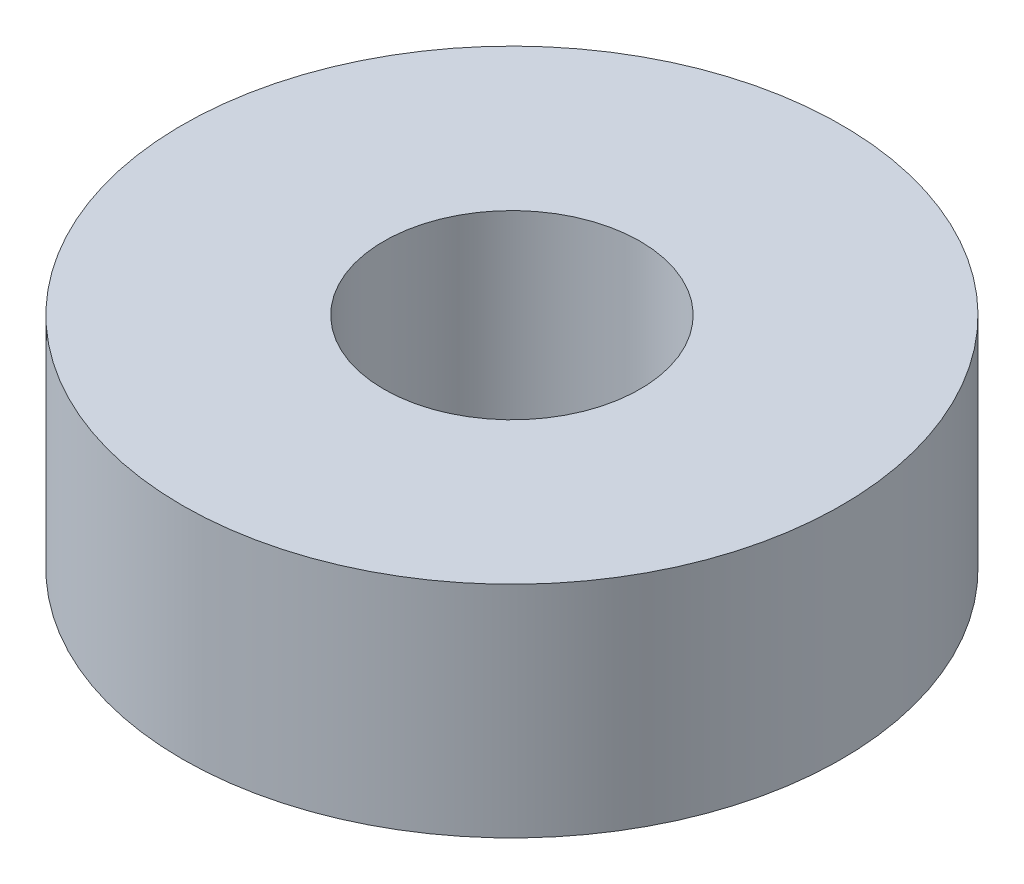
ISO-10303-21;
HEADER;
FILE_DESCRIPTION(('STEP AP214'),'2;1');
FILE_NAME('part.step','',(''),(''),'','','');
FILE_SCHEMA(('AUTOMOTIVE_DESIGN { 1 0 10303 214 1 1 1 1 }'));
ENDSEC;
DATA;
#1=APPLICATION_CONTEXT('core data for automotive mechanical design processes');
#2=APPLICATION_PROTOCOL_DEFINITION('international standard','automotive_design',2000,#1);
#3=PRODUCT_CONTEXT('',#1,'mechanical');
#4=PRODUCT('Part','Part','',(#3));
#5=PRODUCT_RELATED_PRODUCT_CATEGORY('part','',(#4));
#6=PRODUCT_DEFINITION_FORMATION('','',#4);
#7=PRODUCT_DEFINITION_CONTEXT('part definition',#1,'design');
#8=PRODUCT_DEFINITION('design','',#6,#7);
#9=PRODUCT_DEFINITION_SHAPE('','',#8);
#10=(LENGTH_UNIT() NAMED_UNIT(*) SI_UNIT(.MILLI.,.METRE.));
#11=(NAMED_UNIT(*) PLANE_ANGLE_UNIT() SI_UNIT($,.RADIAN.));
#12=(NAMED_UNIT(*) SI_UNIT($,.STERADIAN.) SOLID_ANGLE_UNIT());
#13=UNCERTAINTY_MEASURE_WITH_UNIT(LENGTH_MEASURE(1.E-05),#10,'distance_accuracy_value','');
#14=(GEOMETRIC_REPRESENTATION_CONTEXT(3) GLOBAL_UNCERTAINTY_ASSIGNED_CONTEXT((#13)) GLOBAL_UNIT_ASSIGNED_CONTEXT((#10,
#11,#12)) REPRESENTATION_CONTEXT('',''));
#15=CARTESIAN_POINT('',(0.,0.,0.));
#16=DIRECTION('',(0.,0.,1.));
#17=DIRECTION('',(1.,0.,0.));
#18=AXIS2_PLACEMENT_3D('',#15,#16,#17);
#19=CARTESIAN_POINT('',(0.,3.,0.));
#20=DIRECTION('',(0.,-1.,0.));
#21=DIRECTION('',(0.,0.,-1.));
#22=AXIS2_PLACEMENT_3D('',#19,#20,#21);
#23=CYLINDRICAL_SURFACE('',#22,1.75);
#24=CARTESIAN_POINT('',(0.,3.,0.));
#25=DIRECTION('',(0.,1.,0.));
#26=DIRECTION('',(0.,0.,1.));
#27=AXIS2_PLACEMENT_3D('',#24,#25,#26);
#28=CIRCLE('',#27,1.75);
#29=CARTESIAN_POINT('',(0.,3.,1.75));
#30=VERTEX_POINT('',#29);
#31=EDGE_CURVE('E46',#30,#30,#28,.T.);
#32=ORIENTED_EDGE('',*,*,#31,.T.);
#33=EDGE_LOOP('',(#32));
#34=FACE_BOUND('',#33,.T.);
#35=CARTESIAN_POINT('',(0.,0.,0.));
#36=DIRECTION('',(0.,1.,0.));
#37=DIRECTION('',(0.,0.,1.));
#38=AXIS2_PLACEMENT_3D('',#35,#36,#37);
#39=CIRCLE('',#38,1.75);
#40=CARTESIAN_POINT('',(0.,0.,1.75));
#41=VERTEX_POINT('',#40);
#42=EDGE_CURVE('E52',#41,#41,#39,.T.);
#43=ORIENTED_EDGE('',*,*,#42,.F.);
#44=EDGE_LOOP('',(#43));
#45=FACE_BOUND('',#44,.T.);
#46=ADVANCED_FACE('F39',(#34,#45),#23,.F.);
#47=CARTESIAN_POINT('',(0.,3.,0.));
#48=DIRECTION('',(0.,-1.,0.));
#49=DIRECTION('',(0.,0.,-1.));
#50=AXIS2_PLACEMENT_3D('',#47,#48,#49);
#51=CYLINDRICAL_SURFACE('',#50,4.5);
#52=CARTESIAN_POINT('',(0.,3.,0.));
#53=DIRECTION('',(0.,1.,0.));
#54=DIRECTION('',(0.,0.,1.));
#55=AXIS2_PLACEMENT_3D('',#52,#53,#54);
#56=CIRCLE('',#55,4.5);
#57=CARTESIAN_POINT('',(0.,3.,4.5));
#58=VERTEX_POINT('',#57);
#59=EDGE_CURVE('E10',#58,#58,#56,.T.);
#60=ORIENTED_EDGE('',*,*,#59,.F.);
#61=EDGE_LOOP('',(#60));
#62=FACE_BOUND('',#61,.T.);
#63=CARTESIAN_POINT('',(0.,0.,0.));
#64=DIRECTION('',(0.,1.,0.));
#65=DIRECTION('',(0.,0.,1.));
#66=AXIS2_PLACEMENT_3D('',#63,#64,#65);
#67=CIRCLE('',#66,4.5);
#68=CARTESIAN_POINT('',(0.,0.,4.5));
#69=VERTEX_POINT('',#68);
#70=EDGE_CURVE('E42',#69,#69,#67,.T.);
#71=ORIENTED_EDGE('',*,*,#70,.T.);
#72=EDGE_LOOP('',(#71));
#73=FACE_BOUND('',#72,.T.);
#74=ADVANCED_FACE('F59',(#62,#73),#51,.T.);
#75=CARTESIAN_POINT('',(0.,3.,0.));
#76=DIRECTION('',(0.,1.,0.));
#77=DIRECTION('',(0.,0.,1.));
#78=AXIS2_PLACEMENT_3D('',#75,#76,#77);
#79=PLANE('',#78);
#80=ORIENTED_EDGE('',*,*,#31,.F.);
#81=EDGE_LOOP('',(#80));
#82=FACE_BOUND('',#81,.T.);
#83=ORIENTED_EDGE('',*,*,#59,.T.);
#84=EDGE_LOOP('',(#83));
#85=FACE_BOUND('',#84,.T.);
#86=ADVANCED_FACE('F63',(#82,#85),#79,.T.);
#87=CARTESIAN_POINT('',(0.,0.,0.));
#88=DIRECTION('',(0.,1.,0.));
#89=DIRECTION('',(0.,0.,1.));
#90=AXIS2_PLACEMENT_3D('',#87,#88,#89);
#91=PLANE('',#90);
#92=ORIENTED_EDGE('',*,*,#42,.T.);
#93=EDGE_LOOP('',(#92));
#94=FACE_BOUND('',#93,.T.);
#95=ORIENTED_EDGE('',*,*,#70,.F.);
#96=EDGE_LOOP('',(#95));
#97=FACE_BOUND('',#96,.T.);
#98=ADVANCED_FACE('F61',(#94,#97),#91,.F.);
#99=CLOSED_SHELL('',(#46,#74,#86,#98));
#100=MANIFOLD_SOLID_BREP('B2',#99);
#101=ADVANCED_BREP_SHAPE_REPRESENTATION('',(#18,#100),#14);
#102=SHAPE_DEFINITION_REPRESENTATION(#9,#101);
ENDSEC;
END-ISO-10303-21;
